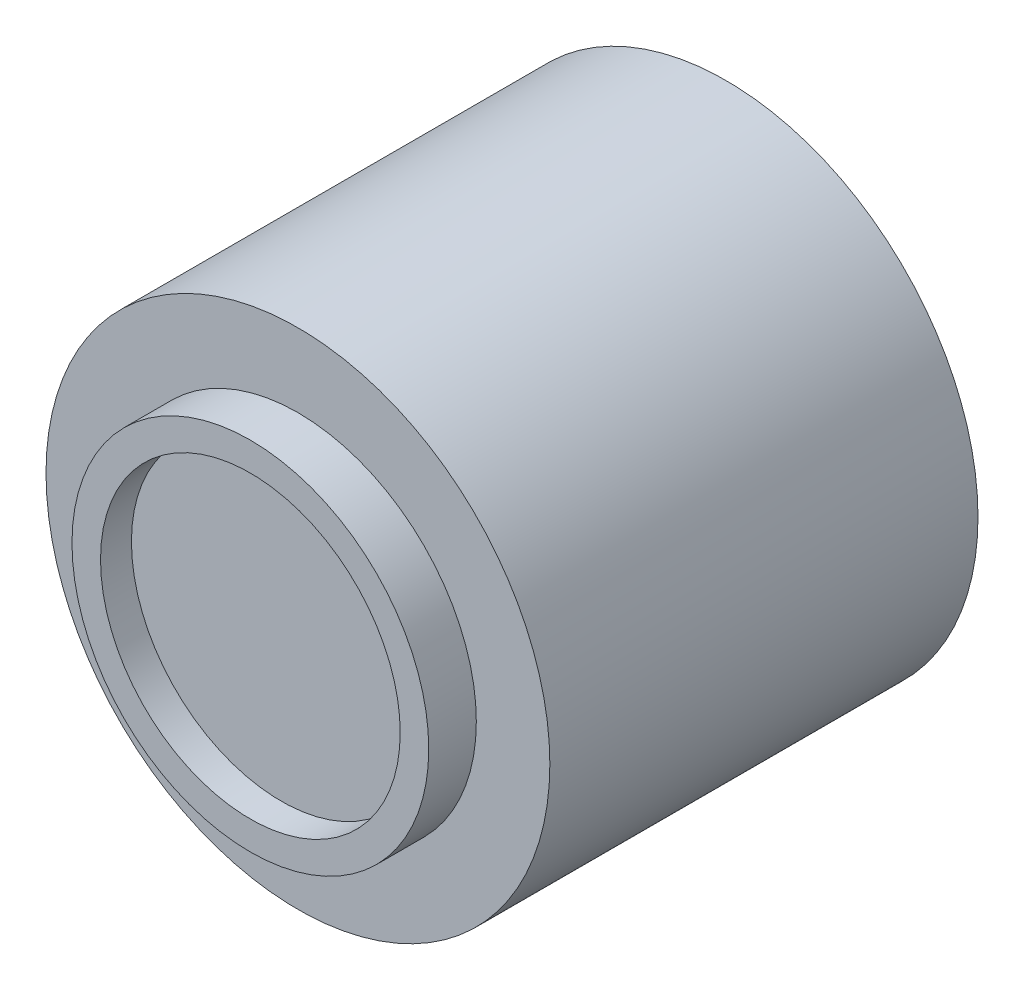
ISO-10303-21;
HEADER;
FILE_DESCRIPTION(('STEP AP214'),'2;1');
FILE_NAME('part.step','',(''),(''),'','','');
FILE_SCHEMA(('AUTOMOTIVE_DESIGN { 1 0 10303 214 1 1 1 1 }'));
ENDSEC;
DATA;
#1=APPLICATION_CONTEXT('core data for automotive mechanical design processes');
#2=APPLICATION_PROTOCOL_DEFINITION('international standard','automotive_design',2000,#1);
#3=PRODUCT_CONTEXT('',#1,'mechanical');
#4=PRODUCT('Part','Part','',(#3));
#5=PRODUCT_RELATED_PRODUCT_CATEGORY('part','',(#4));
#6=PRODUCT_DEFINITION_FORMATION('','',#4);
#7=PRODUCT_DEFINITION_CONTEXT('part definition',#1,'design');
#8=PRODUCT_DEFINITION('design','',#6,#7);
#9=PRODUCT_DEFINITION_SHAPE('','',#8);
#10=(LENGTH_UNIT() NAMED_UNIT(*) SI_UNIT(.MILLI.,.METRE.));
#11=(NAMED_UNIT(*) PLANE_ANGLE_UNIT() SI_UNIT($,.RADIAN.));
#12=(NAMED_UNIT(*) SI_UNIT($,.STERADIAN.) SOLID_ANGLE_UNIT());
#13=UNCERTAINTY_MEASURE_WITH_UNIT(LENGTH_MEASURE(1.E-05),#10,'distance_accuracy_value','');
#14=(GEOMETRIC_REPRESENTATION_CONTEXT(3) GLOBAL_UNCERTAINTY_ASSIGNED_CONTEXT((#13)) GLOBAL_UNIT_ASSIGNED_CONTEXT((#10,
#11,#12)) REPRESENTATION_CONTEXT('',''));
#15=CARTESIAN_POINT('',(0.,0.,0.));
#16=DIRECTION('',(0.,0.,1.));
#17=DIRECTION('',(1.,0.,0.));
#18=AXIS2_PLACEMENT_3D('',#15,#16,#17);
#19=CARTESIAN_POINT('',(0.,0.,100.));
#20=DIRECTION('',(0.,0.,-1.));
#21=DIRECTION('',(-1.,0.,0.));
#22=AXIS2_PLACEMENT_3D('',#19,#20,#21);
#23=CYLINDRICAL_SURFACE('',#22,37.5);
#24=CARTESIAN_POINT('',(0.,0.,100.));
#25=DIRECTION('',(0.,0.,1.));
#26=DIRECTION('',(1.,0.,0.));
#27=AXIS2_PLACEMENT_3D('',#24,#25,#26);
#28=CIRCLE('',#27,37.5);
#29=CARTESIAN_POINT('',(37.5,0.,100.));
#30=VERTEX_POINT('',#29);
#31=EDGE_CURVE('E37',#30,#30,#28,.T.);
#32=ORIENTED_EDGE('',*,*,#31,.F.);
#33=EDGE_LOOP('',(#32));
#34=FACE_BOUND('',#33,.T.);
#35=CARTESIAN_POINT('',(0.,0.,90.));
#36=DIRECTION('',(0.,0.,-1.));
#37=DIRECTION('',(-1.,0.,0.));
#38=AXIS2_PLACEMENT_3D('',#35,#36,#37);
#39=CIRCLE('',#38,37.5);
#40=CARTESIAN_POINT('',(-37.5,0.,90.));
#41=VERTEX_POINT('',#40);
#42=EDGE_CURVE('E10',#41,#41,#39,.T.);
#43=ORIENTED_EDGE('',*,*,#42,.F.);
#44=EDGE_LOOP('',(#43));
#45=FACE_BOUND('',#44,.T.);
#46=ADVANCED_FACE('F31',(#34,#45),#23,.T.);
#47=CARTESIAN_POINT('',(0.,0.,100.));
#48=DIRECTION('',(0.,0.,1.));
#49=DIRECTION('',(1.,0.,0.));
#50=AXIS2_PLACEMENT_3D('',#47,#48,#49);
#51=PLANE('',#50);
#52=CARTESIAN_POINT('',(0.,0.,100.));
#53=DIRECTION('',(0.,0.,1.));
#54=DIRECTION('',(1.,0.,0.));
#55=AXIS2_PLACEMENT_3D('',#52,#53,#54);
#56=CIRCLE('',#55,31.5);
#57=CARTESIAN_POINT('',(31.5,0.,100.));
#58=VERTEX_POINT('',#57);
#59=EDGE_CURVE('E45',#58,#58,#56,.T.);
#60=ORIENTED_EDGE('',*,*,#59,.F.);
#61=EDGE_LOOP('',(#60));
#62=FACE_BOUND('',#61,.T.);
#63=ORIENTED_EDGE('',*,*,#31,.T.);
#64=EDGE_LOOP('',(#63));
#65=FACE_BOUND('',#64,.T.);
#66=ADVANCED_FACE('F72',(#62,#65),#51,.T.);
#67=CARTESIAN_POINT('',(0.,0.,93.5));
#68=DIRECTION('',(0.,0.,1.));
#69=DIRECTION('',(1.,0.,0.));
#70=AXIS2_PLACEMENT_3D('',#67,#68,#69);
#71=CYLINDRICAL_SURFACE('',#70,31.5);
#72=CARTESIAN_POINT('',(0.,0.,93.5));
#73=DIRECTION('',(0.,0.,1.));
#74=DIRECTION('',(1.,0.,0.));
#75=AXIS2_PLACEMENT_3D('',#72,#73,#74);
#76=CIRCLE('',#75,31.5);
#77=CARTESIAN_POINT('',(31.5,0.,93.5));
#78=VERTEX_POINT('',#77);
#79=EDGE_CURVE('E41',#78,#78,#76,.T.);
#80=CARTESIAN_POINT('',(31.5,0.,93.5));
#81=CARTESIAN_POINT('',(31.5,0.,93.5677083333333));
#82=CARTESIAN_POINT('',(31.5,0.,93.6354166666667));
#83=CARTESIAN_POINT('',(31.5,0.,93.7708333333333));
#84=CARTESIAN_POINT('',(31.5,0.,93.8385416666667));
#85=CARTESIAN_POINT('',(31.5,0.,93.9739583333333));
#86=CARTESIAN_POINT('',(31.5,0.,94.0416666666667));
#87=CARTESIAN_POINT('',(31.5,0.,94.1770833333333));
#88=CARTESIAN_POINT('',(31.5,0.,94.2447916666667));
#89=CARTESIAN_POINT('',(31.5,0.,94.3802083333333));
#90=CARTESIAN_POINT('',(31.5,0.,94.4479166666667));
#91=CARTESIAN_POINT('',(31.5,0.,94.5833333333333));
#92=CARTESIAN_POINT('',(31.5,0.,94.6510416666667));
#93=CARTESIAN_POINT('',(31.5,0.,94.7864583333333));
#94=CARTESIAN_POINT('',(31.5,0.,94.8541666666667));
#95=CARTESIAN_POINT('',(31.5,0.,94.9895833333333));
#96=CARTESIAN_POINT('',(31.5,0.,95.0572916666667));
#97=CARTESIAN_POINT('',(31.5,0.,95.1927083333333));
#98=CARTESIAN_POINT('',(31.5,0.,95.2604166666667));
#99=CARTESIAN_POINT('',(31.5,0.,95.3958333333333));
#100=CARTESIAN_POINT('',(31.5,0.,95.4635416666667));
#101=CARTESIAN_POINT('',(31.5,0.,95.5989583333333));
#102=CARTESIAN_POINT('',(31.5,0.,95.6666666666667));
#103=CARTESIAN_POINT('',(31.5,0.,95.8020833333333));
#104=CARTESIAN_POINT('',(31.5,0.,95.8697916666667));
#105=CARTESIAN_POINT('',(31.5,0.,96.0052083333333));
#106=CARTESIAN_POINT('',(31.5,0.,96.0729166666667));
#107=CARTESIAN_POINT('',(31.5,0.,96.2083333333333));
#108=CARTESIAN_POINT('',(31.5,0.,96.2760416666667));
#109=CARTESIAN_POINT('',(31.5,0.,96.4114583333333));
#110=CARTESIAN_POINT('',(31.5,0.,96.4791666666667));
#111=CARTESIAN_POINT('',(31.5,0.,96.6145833333333));
#112=CARTESIAN_POINT('',(31.5,0.,96.6822916666667));
#113=CARTESIAN_POINT('',(31.5,0.,96.8177083333333));
#114=CARTESIAN_POINT('',(31.5,0.,96.8854166666667));
#115=CARTESIAN_POINT('',(31.5,0.,97.0208333333333));
#116=CARTESIAN_POINT('',(31.5,0.,97.0885416666667));
#117=CARTESIAN_POINT('',(31.5,0.,97.2239583333333));
#118=CARTESIAN_POINT('',(31.5,0.,97.2916666666667));
#119=CARTESIAN_POINT('',(31.5,0.,97.4270833333333));
#120=CARTESIAN_POINT('',(31.5,0.,97.4947916666667));
#121=CARTESIAN_POINT('',(31.5,0.,97.6302083333333));
#122=CARTESIAN_POINT('',(31.5,0.,97.6979166666667));
#123=CARTESIAN_POINT('',(31.5,0.,97.8333333333333));
#124=CARTESIAN_POINT('',(31.5,0.,97.9010416666667));
#125=CARTESIAN_POINT('',(31.5,0.,98.0364583333333));
#126=CARTESIAN_POINT('',(31.5,0.,98.1041666666667));
#127=CARTESIAN_POINT('',(31.5,0.,98.2395833333333));
#128=CARTESIAN_POINT('',(31.5,0.,98.3072916666667));
#129=CARTESIAN_POINT('',(31.5,0.,98.4427083333333));
#130=CARTESIAN_POINT('',(31.5,0.,98.5104166666667));
#131=CARTESIAN_POINT('',(31.5,0.,98.6458333333333));
#132=CARTESIAN_POINT('',(31.5,0.,98.7135416666667));
#133=CARTESIAN_POINT('',(31.5,0.,98.8489583333333));
#134=CARTESIAN_POINT('',(31.5,0.,98.9166666666667));
#135=CARTESIAN_POINT('',(31.5,0.,99.0520833333333));
#136=CARTESIAN_POINT('',(31.5,0.,99.1197916666667));
#137=CARTESIAN_POINT('',(31.5,0.,99.2552083333333));
#138=CARTESIAN_POINT('',(31.5,0.,99.3229166666667));
#139=CARTESIAN_POINT('',(31.5,0.,99.4583333333333));
#140=CARTESIAN_POINT('',(31.5,0.,99.5260416666667));
#141=CARTESIAN_POINT('',(31.5,0.,99.6614583333333));
#142=CARTESIAN_POINT('',(31.5,0.,99.7291666666667));
#143=CARTESIAN_POINT('',(31.5,0.,99.8645833333333));
#144=CARTESIAN_POINT('',(31.5,0.,99.9322916666667));
#145=CARTESIAN_POINT('',(31.5,0.,100.));
#146=B_SPLINE_CURVE_WITH_KNOTS('',3,(#80,#81,#82,#83,#84,#85,#86,#87,#88,#89,#90,#91,#92,#93,
#94,#95,#96,#97,#98,#99,#100,#101,#102,#103,#104,#105,#106,#107,#108,#109,#110,#111,#112,#113,
#114,#115,#116,#117,#118,#119,#120,#121,#122,#123,#124,#125,#126,#127,#128,#129,#130,#131,#132,
#133,#134,#135,#136,#137,#138,#139,#140,#141,#142,#143,#144,#145),.UNSPECIFIED.,.F.,.F.,(4,2,2,
2,2,2,2,2,2,2,2,2,2,2,2,2,2,2,2,2,2,2,2,2,2,2,2,2,2,2,2,2,4),(0.,0.203124999999998,
0.406249999999997,0.609374999999995,0.812499999999994,1.01562499999999,1.21874999999999,
1.42187499999999,1.62499999999999,1.828125,2.03125,2.234375,2.4375,2.64062499999999,
2.84374999999999,3.04687499999999,3.24999999999999,3.453125,3.65625,3.859375,4.0625,
4.26562499999999,4.46874999999999,4.67187499999999,4.87499999999999,5.078125,5.28125,5.484375,
5.6875,5.890625,6.09374999999999,6.29687499999999,6.49999999999999),.UNSPECIFIED.);
#147=EDGE_CURVE('BSEAM79',#78,#58,#146,.T.);
#148=ORIENTED_EDGE('',*,*,#79,.F.);
#149=ORIENTED_EDGE('',*,*,#59,.T.);
#150=ORIENTED_EDGE('',*,*,#147,.T.);
#151=ORIENTED_EDGE('',*,*,#147,.F.);
#152=EDGE_LOOP('',(#148,#150,#149,#151));
#153=FACE_BOUND('',#152,.T.);
#154=ADVANCED_FACE('F79',(#153),#71,.F.);
#155=CARTESIAN_POINT('',(0.,0.,93.5));
#156=DIRECTION('',(0.,0.,1.));
#157=DIRECTION('',(1.,0.,0.));
#158=AXIS2_PLACEMENT_3D('',#155,#156,#157);
#159=PLANE('',#158);
#160=ORIENTED_EDGE('',*,*,#79,.T.);
#161=EDGE_LOOP('',(#160));
#162=FACE_BOUND('',#161,.T.);
#163=ADVANCED_FACE('F69',(#162),#159,.T.);
#164=CARTESIAN_POINT('',(0.,0.,90.));
#165=DIRECTION('',(0.,0.,-1.));
#166=DIRECTION('',(-1.,0.,0.));
#167=AXIS2_PLACEMENT_3D('',#164,#165,#166);
#168=CYLINDRICAL_SURFACE('',#167,52.9597055752301);
#169=CARTESIAN_POINT('',(0.,0.,90.));
#170=DIRECTION('',(0.,0.,-1.));
#171=DIRECTION('',(-1.,0.,0.));
#172=AXIS2_PLACEMENT_3D('',#169,#170,#171);
#173=CIRCLE('',#172,52.9597055752301);
#174=CARTESIAN_POINT('',(-52.9597055752301,0.,90.));
#175=VERTEX_POINT('',#174);
#176=EDGE_CURVE('E49',#175,#175,#173,.T.);
#177=CARTESIAN_POINT('',(0.,0.,0.));
#178=DIRECTION('',(0.,0.,-1.));
#179=DIRECTION('',(-1.,0.,0.));
#180=AXIS2_PLACEMENT_3D('',#177,#178,#179);
#181=CIRCLE('',#180,52.9597055752301);
#182=CARTESIAN_POINT('',(-52.9597055752301,0.,0.));
#183=VERTEX_POINT('',#182);
#184=EDGE_CURVE('E51',#183,#183,#181,.T.);
#185=CARTESIAN_POINT('',(-52.9597055752301,0.,90.));
#186=CARTESIAN_POINT('',(-52.9597055752301,0.,89.0625));
#187=CARTESIAN_POINT('',(-52.9597055752301,0.,88.125));
#188=CARTESIAN_POINT('',(-52.9597055752301,0.,86.25));
#189=CARTESIAN_POINT('',(-52.9597055752301,0.,85.3125));
#190=CARTESIAN_POINT('',(-52.9597055752301,0.,83.4375));
#191=CARTESIAN_POINT('',(-52.9597055752301,0.,82.5));
#192=CARTESIAN_POINT('',(-52.9597055752301,0.,80.625));
#193=CARTESIAN_POINT('',(-52.9597055752301,0.,79.6875));
#194=CARTESIAN_POINT('',(-52.9597055752301,0.,77.8125));
#195=CARTESIAN_POINT('',(-52.9597055752301,0.,76.875));
#196=CARTESIAN_POINT('',(-52.9597055752301,0.,75.));
#197=CARTESIAN_POINT('',(-52.9597055752301,0.,74.0625));
#198=CARTESIAN_POINT('',(-52.9597055752301,0.,72.1875));
#199=CARTESIAN_POINT('',(-52.9597055752301,0.,71.25));
#200=CARTESIAN_POINT('',(-52.9597055752301,0.,69.375));
#201=CARTESIAN_POINT('',(-52.9597055752301,0.,68.4375));
#202=CARTESIAN_POINT('',(-52.9597055752301,0.,66.5625));
#203=CARTESIAN_POINT('',(-52.9597055752301,0.,65.625));
#204=CARTESIAN_POINT('',(-52.9597055752301,0.,63.75));
#205=CARTESIAN_POINT('',(-52.9597055752301,0.,62.8125));
#206=CARTESIAN_POINT('',(-52.9597055752301,0.,60.9375));
#207=CARTESIAN_POINT('',(-52.9597055752301,0.,60.));
#208=CARTESIAN_POINT('',(-52.9597055752301,0.,58.125));
#209=CARTESIAN_POINT('',(-52.9597055752301,0.,57.1875));
#210=CARTESIAN_POINT('',(-52.9597055752301,0.,55.3125));
#211=CARTESIAN_POINT('',(-52.9597055752301,0.,54.375));
#212=CARTESIAN_POINT('',(-52.9597055752301,0.,52.5));
#213=CARTESIAN_POINT('',(-52.9597055752301,0.,51.5625));
#214=CARTESIAN_POINT('',(-52.9597055752301,0.,49.6875));
#215=CARTESIAN_POINT('',(-52.9597055752301,0.,48.75));
#216=CARTESIAN_POINT('',(-52.9597055752301,0.,46.875));
#217=CARTESIAN_POINT('',(-52.9597055752301,0.,45.9375));
#218=CARTESIAN_POINT('',(-52.9597055752301,0.,44.0625));
#219=CARTESIAN_POINT('',(-52.9597055752301,0.,43.125));
#220=CARTESIAN_POINT('',(-52.9597055752301,0.,41.25));
#221=CARTESIAN_POINT('',(-52.9597055752301,0.,40.3125));
#222=CARTESIAN_POINT('',(-52.9597055752301,0.,38.4375));
#223=CARTESIAN_POINT('',(-52.9597055752301,0.,37.5));
#224=CARTESIAN_POINT('',(-52.9597055752301,0.,35.625));
#225=CARTESIAN_POINT('',(-52.9597055752301,0.,34.6875));
#226=CARTESIAN_POINT('',(-52.9597055752301,0.,32.8125));
#227=CARTESIAN_POINT('',(-52.9597055752301,0.,31.875));
#228=CARTESIAN_POINT('',(-52.9597055752301,0.,30.));
#229=CARTESIAN_POINT('',(-52.9597055752301,0.,29.0625));
#230=CARTESIAN_POINT('',(-52.9597055752301,0.,27.1875));
#231=CARTESIAN_POINT('',(-52.9597055752301,0.,26.25));
#232=CARTESIAN_POINT('',(-52.9597055752301,0.,24.375));
#233=CARTESIAN_POINT('',(-52.9597055752301,0.,23.4375));
#234=CARTESIAN_POINT('',(-52.9597055752301,0.,21.5625));
#235=CARTESIAN_POINT('',(-52.9597055752301,0.,20.625));
#236=CARTESIAN_POINT('',(-52.9597055752301,0.,18.75));
#237=CARTESIAN_POINT('',(-52.9597055752301,0.,17.8125));
#238=CARTESIAN_POINT('',(-52.9597055752301,0.,15.9375));
#239=CARTESIAN_POINT('',(-52.9597055752301,0.,15.));
#240=CARTESIAN_POINT('',(-52.9597055752301,0.,13.125));
#241=CARTESIAN_POINT('',(-52.9597055752301,0.,12.1875));
#242=CARTESIAN_POINT('',(-52.9597055752301,0.,10.3125));
#243=CARTESIAN_POINT('',(-52.9597055752301,0.,9.37500000000001));
#244=CARTESIAN_POINT('',(-52.9597055752301,0.,7.50000000000002));
#245=CARTESIAN_POINT('',(-52.9597055752301,0.,6.56250000000002));
#246=CARTESIAN_POINT('',(-52.9597055752301,0.,4.68750000000002));
#247=CARTESIAN_POINT('',(-52.9597055752301,0.,3.75000000000001));
#248=CARTESIAN_POINT('',(-52.9597055752301,0.,1.87500000000001));
#249=CARTESIAN_POINT('',(-52.9597055752301,0.,0.937500000000014));
#250=CARTESIAN_POINT('',(-52.9597055752301,0.,0.));
#251=B_SPLINE_CURVE_WITH_KNOTS('',3,(#185,#186,#187,#188,#189,#190,#191,#192,#193,#194,#195,
#196,#197,#198,#199,#200,#201,#202,#203,#204,#205,#206,#207,#208,#209,#210,#211,#212,#213,#214,
#215,#216,#217,#218,#219,#220,#221,#222,#223,#224,#225,#226,#227,#228,#229,#230,#231,#232,#233,
#234,#235,#236,#237,#238,#239,#240,#241,#242,#243,#244,#245,#246,#247,#248,#249,#250),
.UNSPECIFIED.,.F.,.F.,(4,2,2,2,2,2,2,2,2,2,2,2,2,2,2,2,2,2,2,2,2,2,2,2,2,2,2,2,2,2,2,2,4),(0.,
2.81250000000001,5.62500000000001,8.4375,11.25,14.0625,16.875,19.6875,22.5,25.3125,28.125,
30.9375,33.75,36.5625,39.375,42.1875,45.,47.8125,50.625,53.4375,56.25,59.0625,61.875,64.6875,
67.5,70.3125,73.125,75.9375,78.75,81.5625,84.375,87.1875,90.),.UNSPECIFIED.);
#252=EDGE_CURVE('BSEAM57',#175,#183,#251,.T.);
#253=ORIENTED_EDGE('',*,*,#176,.T.);
#254=ORIENTED_EDGE('',*,*,#184,.F.);
#255=ORIENTED_EDGE('',*,*,#252,.T.);
#256=ORIENTED_EDGE('',*,*,#252,.F.);
#257=EDGE_LOOP('',(#253,#255,#254,#256));
#258=FACE_BOUND('',#257,.T.);
#259=ADVANCED_FACE('F57',(#258),#168,.T.);
#260=CARTESIAN_POINT('',(0.,0.,90.));
#261=DIRECTION('',(0.,0.,-1.));
#262=DIRECTION('',(-1.,0.,0.));
#263=AXIS2_PLACEMENT_3D('',#260,#261,#262);
#264=PLANE('',#263);
#265=ORIENTED_EDGE('',*,*,#42,.T.);
#266=EDGE_LOOP('',(#265));
#267=FACE_BOUND('',#266,.T.);
#268=ORIENTED_EDGE('',*,*,#176,.F.);
#269=EDGE_LOOP('',(#268));
#270=FACE_BOUND('',#269,.T.);
#271=ADVANCED_FACE('F60',(#267,#270),#264,.F.);
#272=CARTESIAN_POINT('',(0.,0.,0.));
#273=DIRECTION('',(0.,0.,1.));
#274=DIRECTION('',(1.,0.,0.));
#275=AXIS2_PLACEMENT_3D('',#272,#273,#274);
#276=PLANE('',#275);
#277=ORIENTED_EDGE('',*,*,#184,.T.);
#278=EDGE_LOOP('',(#277));
#279=FACE_BOUND('',#278,.T.);
#280=ADVANCED_FACE('F62',(#279),#276,.F.);
#281=CLOSED_SHELL('',(#46,#66,#154,#163,#259,#271,#280));
#282=MANIFOLD_SOLID_BREP('B2',#281);
#283=ADVANCED_BREP_SHAPE_REPRESENTATION('',(#18,#282),#14);
#284=SHAPE_DEFINITION_REPRESENTATION(#9,#283);
ENDSEC;
END-ISO-10303-21;
